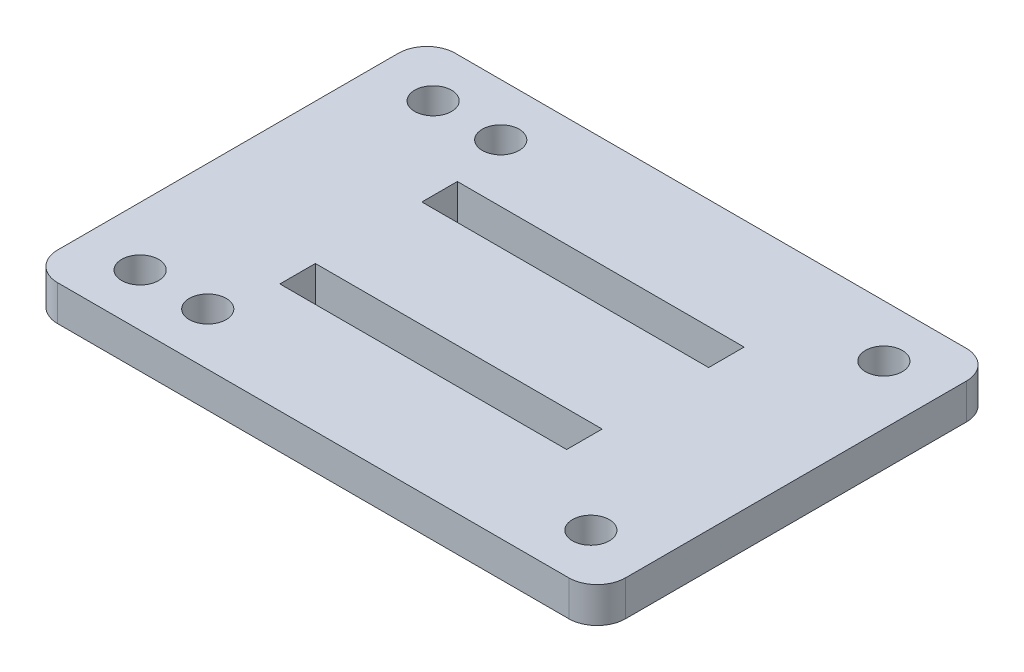
ISO-10303-21;
HEADER;
FILE_DESCRIPTION(('STEP AP214'),'2;1');
FILE_NAME('part.step','',(''),(''),'','','');
FILE_SCHEMA(('AUTOMOTIVE_DESIGN { 1 0 10303 214 1 1 1 1 }'));
ENDSEC;
DATA;
#1=APPLICATION_CONTEXT('core data for automotive mechanical design processes');
#2=APPLICATION_PROTOCOL_DEFINITION('international standard','automotive_design',2000,#1);
#3=PRODUCT_CONTEXT('',#1,'mechanical');
#4=PRODUCT('Part','Part','',(#3));
#5=PRODUCT_RELATED_PRODUCT_CATEGORY('part','',(#4));
#6=PRODUCT_DEFINITION_FORMATION('','',#4);
#7=PRODUCT_DEFINITION_CONTEXT('part definition',#1,'design');
#8=PRODUCT_DEFINITION('design','',#6,#7);
#9=PRODUCT_DEFINITION_SHAPE('','',#8);
#10=(LENGTH_UNIT() NAMED_UNIT(*) SI_UNIT(.MILLI.,.METRE.));
#11=(NAMED_UNIT(*) PLANE_ANGLE_UNIT() SI_UNIT($,.RADIAN.));
#12=(NAMED_UNIT(*) SI_UNIT($,.STERADIAN.) SOLID_ANGLE_UNIT());
#13=UNCERTAINTY_MEASURE_WITH_UNIT(LENGTH_MEASURE(1.E-05),#10,'distance_accuracy_value','');
#14=(GEOMETRIC_REPRESENTATION_CONTEXT(3) GLOBAL_UNCERTAINTY_ASSIGNED_CONTEXT((#13)) GLOBAL_UNIT_ASSIGNED_CONTEXT((#10,
#11,#12)) REPRESENTATION_CONTEXT('',''));
#15=CARTESIAN_POINT('',(0.,0.,0.));
#16=DIRECTION('',(0.,0.,1.));
#17=DIRECTION('',(1.,0.,0.));
#18=AXIS2_PLACEMENT_3D('',#15,#16,#17);
#19=CARTESIAN_POINT('',(40.,5.,28.));
#20=DIRECTION('',(-1.,0.,0.));
#21=DIRECTION('',(0.,0.,1.));
#22=AXIS2_PLACEMENT_3D('',#19,#20,#21);
#23=PLANE('',#22);
#24=DIRECTION('',(0.,0.,-1.));
#25=VECTOR('',#24,1.);
#26=CARTESIAN_POINT('',(40.,0.,28.));
#27=LINE('',#26,#25);
#28=CARTESIAN_POINT('',(40.,0.,24.));
#29=VERTEX_POINT('',#28);
#30=CARTESIAN_POINT('',(40.,0.,-24.));
#31=VERTEX_POINT('',#30);
#32=EDGE_CURVE('E258',#29,#31,#27,.T.);
#33=ORIENTED_EDGE('',*,*,#32,.T.);
#34=DIRECTION('',(0.,-1.,0.));
#35=VECTOR('',#34,1.);
#36=CARTESIAN_POINT('',(40.,5.,-24.));
#37=LINE('',#36,#35);
#38=CARTESIAN_POINT('',(40.,5.,-24.));
#39=VERTEX_POINT('',#38);
#40=EDGE_CURVE('E307',#31,#39,#37,.F.);
#41=ORIENTED_EDGE('',*,*,#40,.T.);
#42=DIRECTION('',(0.,0.,-1.));
#43=VECTOR('',#42,1.);
#44=CARTESIAN_POINT('',(40.,5.,28.));
#45=LINE('',#44,#43);
#46=CARTESIAN_POINT('',(40.,5.,24.));
#47=VERTEX_POINT('',#46);
#48=EDGE_CURVE('E259',#47,#39,#45,.T.);
#49=ORIENTED_EDGE('',*,*,#48,.F.);
#50=DIRECTION('',(0.,-1.,0.));
#51=VECTOR('',#50,1.);
#52=CARTESIAN_POINT('',(40.,5.,24.));
#53=LINE('',#52,#51);
#54=EDGE_CURVE('E304',#47,#29,#53,.T.);
#55=ORIENTED_EDGE('',*,*,#54,.T.);
#56=EDGE_LOOP('',(#33,#41,#49,#55));
#57=FACE_BOUND('',#56,.T.);
#58=ADVANCED_FACE('F45',(#57),#23,.F.);
#59=CARTESIAN_POINT('',(-40.,5.,-28.));
#60=DIRECTION('',(0.,0.,1.));
#61=DIRECTION('',(1.,0.,0.));
#62=AXIS2_PLACEMENT_3D('',#59,#60,#61);
#63=PLANE('',#62);
#64=DIRECTION('',(-1.,0.,0.));
#65=VECTOR('',#64,1.);
#66=CARTESIAN_POINT('',(-40.,0.,-28.));
#67=LINE('',#66,#65);
#68=CARTESIAN_POINT('',(36.,0.,-28.));
#69=VERTEX_POINT('',#68);
#70=CARTESIAN_POINT('',(-36.,0.,-28.));
#71=VERTEX_POINT('',#70);
#72=EDGE_CURVE('E273',#69,#71,#67,.T.);
#73=ORIENTED_EDGE('',*,*,#72,.T.);
#74=DIRECTION('',(0.,-1.,0.));
#75=VECTOR('',#74,1.);
#76=CARTESIAN_POINT('',(-36.,5.,-28.));
#77=LINE('',#76,#75);
#78=CARTESIAN_POINT('',(-36.,5.,-28.));
#79=VERTEX_POINT('',#78);
#80=EDGE_CURVE('E295',#71,#79,#77,.F.);
#81=ORIENTED_EDGE('',*,*,#80,.T.);
#82=DIRECTION('',(-1.,0.,0.));
#83=VECTOR('',#82,1.);
#84=CARTESIAN_POINT('',(-40.,5.,-28.));
#85=LINE('',#84,#83);
#86=CARTESIAN_POINT('',(36.,5.,-28.));
#87=VERTEX_POINT('',#86);
#88=EDGE_CURVE('E262',#87,#79,#85,.T.);
#89=ORIENTED_EDGE('',*,*,#88,.F.);
#90=DIRECTION('',(0.,-1.,0.));
#91=VECTOR('',#90,1.);
#92=CARTESIAN_POINT('',(36.,5.,-28.));
#93=LINE('',#92,#91);
#94=EDGE_CURVE('E292',#87,#69,#93,.T.);
#95=ORIENTED_EDGE('',*,*,#94,.T.);
#96=EDGE_LOOP('',(#73,#81,#89,#95));
#97=FACE_BOUND('',#96,.T.);
#98=ADVANCED_FACE('F331',(#97),#63,.F.);
#99=CARTESIAN_POINT('',(-40.,5.,28.));
#100=DIRECTION('',(1.,0.,0.));
#101=DIRECTION('',(0.,0.,-1.));
#102=AXIS2_PLACEMENT_3D('',#99,#100,#101);
#103=PLANE('',#102);
#104=DIRECTION('',(0.,0.,1.));
#105=VECTOR('',#104,1.);
#106=CARTESIAN_POINT('',(-40.,5.,28.));
#107=LINE('',#106,#105);
#108=CARTESIAN_POINT('',(-40.,5.,-24.));
#109=VERTEX_POINT('',#108);
#110=CARTESIAN_POINT('',(-40.,5.,24.));
#111=VERTEX_POINT('',#110);
#112=EDGE_CURVE('E266',#109,#111,#107,.T.);
#113=ORIENTED_EDGE('',*,*,#112,.F.);
#114=DIRECTION('',(0.,-1.,0.));
#115=VECTOR('',#114,1.);
#116=CARTESIAN_POINT('',(-40.,5.,-24.));
#117=LINE('',#116,#115);
#118=CARTESIAN_POINT('',(-40.,0.,-24.));
#119=VERTEX_POINT('',#118);
#120=EDGE_CURVE('E281',#109,#119,#117,.T.);
#121=ORIENTED_EDGE('',*,*,#120,.T.);
#122=DIRECTION('',(0.,0.,1.));
#123=VECTOR('',#122,1.);
#124=CARTESIAN_POINT('',(-40.,0.,28.));
#125=LINE('',#124,#123);
#126=CARTESIAN_POINT('',(-40.,0.,24.));
#127=VERTEX_POINT('',#126);
#128=EDGE_CURVE('E276',#119,#127,#125,.T.);
#129=ORIENTED_EDGE('',*,*,#128,.T.);
#130=DIRECTION('',(0.,-1.,0.));
#131=VECTOR('',#130,1.);
#132=CARTESIAN_POINT('',(-40.,5.,24.));
#133=LINE('',#132,#131);
#134=EDGE_CURVE('E270',#127,#111,#133,.F.);
#135=ORIENTED_EDGE('',*,*,#134,.T.);
#136=EDGE_LOOP('',(#113,#121,#129,#135));
#137=FACE_BOUND('',#136,.T.);
#138=ADVANCED_FACE('F339',(#137),#103,.F.);
#139=CARTESIAN_POINT('',(-40.,5.,28.));
#140=DIRECTION('',(0.,0.,-1.));
#141=DIRECTION('',(-1.,0.,0.));
#142=AXIS2_PLACEMENT_3D('',#139,#140,#141);
#143=PLANE('',#142);
#144=DIRECTION('',(1.,0.,0.));
#145=VECTOR('',#144,1.);
#146=CARTESIAN_POINT('',(-40.,0.,28.));
#147=LINE('',#146,#145);
#148=CARTESIAN_POINT('',(-36.,0.,28.));
#149=VERTEX_POINT('',#148);
#150=CARTESIAN_POINT('',(36.,0.,28.));
#151=VERTEX_POINT('',#150);
#152=EDGE_CURVE('E263',#149,#151,#147,.T.);
#153=ORIENTED_EDGE('',*,*,#152,.T.);
#154=DIRECTION('',(0.,-1.,0.));
#155=VECTOR('',#154,1.);
#156=CARTESIAN_POINT('',(36.,5.,28.));
#157=LINE('',#156,#155);
#158=CARTESIAN_POINT('',(36.,5.,28.));
#159=VERTEX_POINT('',#158);
#160=EDGE_CURVE('E11',#151,#159,#157,.F.);
#161=ORIENTED_EDGE('',*,*,#160,.T.);
#162=DIRECTION('',(1.,0.,0.));
#163=VECTOR('',#162,1.);
#164=CARTESIAN_POINT('',(-40.,5.,28.));
#165=LINE('',#164,#163);
#166=CARTESIAN_POINT('',(-36.,5.,28.));
#167=VERTEX_POINT('',#166);
#168=EDGE_CURVE('E268',#167,#159,#165,.T.);
#169=ORIENTED_EDGE('',*,*,#168,.F.);
#170=DIRECTION('',(0.,-1.,0.));
#171=VECTOR('',#170,1.);
#172=CARTESIAN_POINT('',(-36.,5.,28.));
#173=LINE('',#172,#171);
#174=EDGE_CURVE('E53',#167,#149,#173,.T.);
#175=ORIENTED_EDGE('',*,*,#174,.T.);
#176=EDGE_LOOP('',(#153,#161,#169,#175));
#177=FACE_BOUND('',#176,.T.);
#178=ADVANCED_FACE('F311',(#177),#143,.F.);
#179=CARTESIAN_POINT('',(0.,5.,0.));
#180=DIRECTION('',(0.,-1.,0.));
#181=DIRECTION('',(0.,0.,-1.));
#182=AXIS2_PLACEMENT_3D('',#179,#180,#181);
#183=PLANE('',#182);
#184=DIRECTION('',(-1.,0.,0.));
#185=VECTOR('',#184,1.);
#186=CARTESIAN_POINT('',(-20.2,5.,-7.5));
#187=LINE('',#186,#185);
#188=CARTESIAN_POINT('',(20.2,5.,-7.5));
#189=VERTEX_POINT('',#188);
#190=CARTESIAN_POINT('',(-20.2,5.,-7.5));
#191=VERTEX_POINT('',#190);
#192=EDGE_CURVE('E208',#189,#191,#187,.T.);
#193=ORIENTED_EDGE('',*,*,#192,.T.);
#194=DIRECTION('',(0.,0.,-1.));
#195=VECTOR('',#194,1.);
#196=CARTESIAN_POINT('',(-20.2,5.,-12.5));
#197=LINE('',#196,#195);
#198=CARTESIAN_POINT('',(-20.2,5.,-12.5));
#199=VERTEX_POINT('',#198);
#200=EDGE_CURVE('E212',#191,#199,#197,.T.);
#201=ORIENTED_EDGE('',*,*,#200,.T.);
#202=DIRECTION('',(1.,0.,0.));
#203=VECTOR('',#202,1.);
#204=CARTESIAN_POINT('',(-20.2,5.,-12.5));
#205=LINE('',#204,#203);
#206=CARTESIAN_POINT('',(20.2,5.,-12.5));
#207=VERTEX_POINT('',#206);
#208=EDGE_CURVE('E235',#199,#207,#205,.T.);
#209=ORIENTED_EDGE('',*,*,#208,.T.);
#210=DIRECTION('',(0.,0.,1.));
#211=VECTOR('',#210,1.);
#212=CARTESIAN_POINT('',(20.2,5.,-12.5));
#213=LINE('',#212,#211);
#214=EDGE_CURVE('E232',#207,#189,#213,.T.);
#215=ORIENTED_EDGE('',*,*,#214,.T.);
#216=EDGE_LOOP('',(#193,#201,#209,#215));
#217=FACE_BOUND('',#216,.T.);
#218=CARTESIAN_POINT('',(-31.75,5.,20.6375));
#219=DIRECTION('',(0.,-1.,0.));
#220=DIRECTION('',(0.,0.,-1.));
#221=AXIS2_PLACEMENT_3D('',#218,#219,#220);
#222=CIRCLE('',#221,2.6);
#223=CARTESIAN_POINT('',(-31.75,5.,18.0375));
#224=VERTEX_POINT('',#223);
#225=EDGE_CURVE('E200',#224,#224,#222,.T.);
#226=ORIENTED_EDGE('',*,*,#225,.T.);
#227=EDGE_LOOP('',(#226));
#228=FACE_BOUND('',#227,.T.);
#229=CARTESIAN_POINT('',(31.75,5.,20.6375));
#230=DIRECTION('',(0.,-1.,0.));
#231=DIRECTION('',(0.,0.,-1.));
#232=AXIS2_PLACEMENT_3D('',#229,#230,#231);
#233=CIRCLE('',#232,2.6);
#234=CARTESIAN_POINT('',(31.75,5.,18.0375));
#235=VERTEX_POINT('',#234);
#236=EDGE_CURVE('E207',#235,#235,#233,.T.);
#237=ORIENTED_EDGE('',*,*,#236,.T.);
#238=EDGE_LOOP('',(#237));
#239=FACE_BOUND('',#238,.T.);
#240=CARTESIAN_POINT('',(-31.75,5.,-20.6375));
#241=DIRECTION('',(0.,-1.,0.));
#242=DIRECTION('',(0.,0.,-1.));
#243=AXIS2_PLACEMENT_3D('',#240,#241,#242);
#244=CIRCLE('',#243,2.6);
#245=CARTESIAN_POINT('',(-31.75,5.,-23.2375));
#246=VERTEX_POINT('',#245);
#247=EDGE_CURVE('E241',#246,#246,#244,.T.);
#248=ORIENTED_EDGE('',*,*,#247,.T.);
#249=EDGE_LOOP('',(#248));
#250=FACE_BOUND('',#249,.T.);
#251=DIRECTION('',(1.,0.,0.));
#252=VECTOR('',#251,1.);
#253=CARTESIAN_POINT('',(-20.2,5.,7.5));
#254=LINE('',#253,#252);
#255=CARTESIAN_POINT('',(-20.2,5.,7.5));
#256=VERTEX_POINT('',#255);
#257=CARTESIAN_POINT('',(20.2,5.,7.5));
#258=VERTEX_POINT('',#257);
#259=EDGE_CURVE('E183',#256,#258,#254,.T.);
#260=ORIENTED_EDGE('',*,*,#259,.T.);
#261=DIRECTION('',(0.,0.,1.));
#262=VECTOR('',#261,1.);
#263=CARTESIAN_POINT('',(20.2,5.,12.5));
#264=LINE('',#263,#262);
#265=CARTESIAN_POINT('',(20.2,5.,12.5));
#266=VERTEX_POINT('',#265);
#267=EDGE_CURVE('E168',#258,#266,#264,.T.);
#268=ORIENTED_EDGE('',*,*,#267,.T.);
#269=DIRECTION('',(-1.,0.,0.));
#270=VECTOR('',#269,1.);
#271=CARTESIAN_POINT('',(-20.2,5.,12.5));
#272=LINE('',#271,#270);
#273=CARTESIAN_POINT('',(-20.2,5.,12.5));
#274=VERTEX_POINT('',#273);
#275=EDGE_CURVE('E158',#266,#274,#272,.T.);
#276=ORIENTED_EDGE('',*,*,#275,.T.);
#277=DIRECTION('',(0.,0.,-1.));
#278=VECTOR('',#277,1.);
#279=CARTESIAN_POINT('',(-20.2,5.,12.5));
#280=LINE('',#279,#278);
#281=EDGE_CURVE('E169',#274,#256,#280,.T.);
#282=ORIENTED_EDGE('',*,*,#281,.T.);
#283=EDGE_LOOP('',(#260,#268,#276,#282));
#284=FACE_BOUND('',#283,.T.);
#285=CARTESIAN_POINT('',(-22.225,5.,-20.6375));
#286=DIRECTION('',(0.,-1.,0.));
#287=DIRECTION('',(0.,0.,-1.));
#288=AXIS2_PLACEMENT_3D('',#285,#286,#287);
#289=CIRCLE('',#288,2.6);
#290=CARTESIAN_POINT('',(-22.225,5.,-23.2375));
#291=VERTEX_POINT('',#290);
#292=EDGE_CURVE('E188',#291,#291,#289,.T.);
#293=ORIENTED_EDGE('',*,*,#292,.T.);
#294=EDGE_LOOP('',(#293));
#295=FACE_BOUND('',#294,.T.);
#296=CARTESIAN_POINT('',(-22.225,5.,20.6375));
#297=DIRECTION('',(0.,-1.,0.));
#298=DIRECTION('',(0.,0.,-1.));
#299=AXIS2_PLACEMENT_3D('',#296,#297,#298);
#300=CIRCLE('',#299,2.6);
#301=CARTESIAN_POINT('',(-22.225,5.,18.0375));
#302=VERTEX_POINT('',#301);
#303=EDGE_CURVE('E195',#302,#302,#300,.T.);
#304=ORIENTED_EDGE('',*,*,#303,.T.);
#305=EDGE_LOOP('',(#304));
#306=FACE_BOUND('',#305,.T.);
#307=CARTESIAN_POINT('',(31.75,5.,-20.6375));
#308=DIRECTION('',(0.,-1.,0.));
#309=DIRECTION('',(0.,0.,-1.));
#310=AXIS2_PLACEMENT_3D('',#307,#308,#309);
#311=CIRCLE('',#310,2.6);
#312=CARTESIAN_POINT('',(31.75,5.,-23.2375));
#313=VERTEX_POINT('',#312);
#314=EDGE_CURVE('E255',#313,#313,#311,.T.);
#315=ORIENTED_EDGE('',*,*,#314,.T.);
#316=EDGE_LOOP('',(#315));
#317=FACE_BOUND('',#316,.T.);
#318=ORIENTED_EDGE('',*,*,#88,.T.);
#319=CARTESIAN_POINT('',(-36.,5.,-24.));
#320=DIRECTION('',(0.,-1.,0.));
#321=DIRECTION('',(0.,0.,-1.));
#322=AXIS2_PLACEMENT_3D('',#319,#320,#321);
#323=CIRCLE('',#322,4.);
#324=EDGE_CURVE('E302',#79,#109,#323,.F.);
#325=ORIENTED_EDGE('',*,*,#324,.T.);
#326=ORIENTED_EDGE('',*,*,#112,.T.);
#327=CARTESIAN_POINT('',(-36.,5.,24.));
#328=DIRECTION('',(0.,-1.,0.));
#329=DIRECTION('',(0.,0.,-1.));
#330=AXIS2_PLACEMENT_3D('',#327,#328,#329);
#331=CIRCLE('',#330,4.);
#332=EDGE_CURVE('E65',#111,#167,#331,.F.);
#333=ORIENTED_EDGE('',*,*,#332,.T.);
#334=ORIENTED_EDGE('',*,*,#168,.T.);
#335=CARTESIAN_POINT('',(36.,5.,24.));
#336=DIRECTION('',(0.,-1.,0.));
#337=DIRECTION('',(0.,0.,-1.));
#338=AXIS2_PLACEMENT_3D('',#335,#336,#337);
#339=CIRCLE('',#338,4.);
#340=EDGE_CURVE('E298',#159,#47,#339,.F.);
#341=ORIENTED_EDGE('',*,*,#340,.T.);
#342=ORIENTED_EDGE('',*,*,#48,.T.);
#343=CARTESIAN_POINT('',(36.,5.,-24.));
#344=DIRECTION('',(0.,-1.,0.));
#345=DIRECTION('',(0.,0.,-1.));
#346=AXIS2_PLACEMENT_3D('',#343,#344,#345);
#347=CIRCLE('',#346,4.);
#348=EDGE_CURVE('E300',#39,#87,#347,.F.);
#349=ORIENTED_EDGE('',*,*,#348,.T.);
#350=EDGE_LOOP('',(#318,#325,#326,#333,#334,#341,#342,#349));
#351=FACE_BOUND('',#350,.T.);
#352=ADVANCED_FACE('F180',(#217,#228,#239,#250,#284,#295,#306,#317,#351),#183,.F.);
#353=CARTESIAN_POINT('',(0.,0.,0.));
#354=DIRECTION('',(0.,-1.,0.));
#355=DIRECTION('',(0.,0.,-1.));
#356=AXIS2_PLACEMENT_3D('',#353,#354,#355);
#357=PLANE('',#356);
#358=DIRECTION('',(0.,0.,1.));
#359=VECTOR('',#358,1.);
#360=CARTESIAN_POINT('',(-20.2,0.,-12.5));
#361=LINE('',#360,#359);
#362=CARTESIAN_POINT('',(-20.2,0.,-12.5));
#363=VERTEX_POINT('',#362);
#364=CARTESIAN_POINT('',(-20.2,0.,-7.5));
#365=VERTEX_POINT('',#364);
#366=EDGE_CURVE('E224',#363,#365,#361,.T.);
#367=ORIENTED_EDGE('',*,*,#366,.T.);
#368=DIRECTION('',(1.,0.,0.));
#369=VECTOR('',#368,1.);
#370=CARTESIAN_POINT('',(-20.2,0.,-7.5));
#371=LINE('',#370,#369);
#372=CARTESIAN_POINT('',(20.2,0.,-7.5));
#373=VERTEX_POINT('',#372);
#374=EDGE_CURVE('E221',#365,#373,#371,.T.);
#375=ORIENTED_EDGE('',*,*,#374,.T.);
#376=DIRECTION('',(0.,0.,-1.));
#377=VECTOR('',#376,1.);
#378=CARTESIAN_POINT('',(20.2,0.,-12.5));
#379=LINE('',#378,#377);
#380=CARTESIAN_POINT('',(20.2,0.,-12.5));
#381=VERTEX_POINT('',#380);
#382=EDGE_CURVE('E204',#373,#381,#379,.T.);
#383=ORIENTED_EDGE('',*,*,#382,.T.);
#384=DIRECTION('',(-1.,0.,0.));
#385=VECTOR('',#384,1.);
#386=CARTESIAN_POINT('',(-20.2,0.,-12.5));
#387=LINE('',#386,#385);
#388=EDGE_CURVE('E227',#381,#363,#387,.T.);
#389=ORIENTED_EDGE('',*,*,#388,.T.);
#390=EDGE_LOOP('',(#367,#375,#383,#389));
#391=FACE_BOUND('',#390,.T.);
#392=CARTESIAN_POINT('',(-31.75,0.,20.6375));
#393=DIRECTION('',(0.,1.,0.));
#394=DIRECTION('',(0.,0.,-1.));
#395=AXIS2_PLACEMENT_3D('',#392,#393,#394);
#396=CIRCLE('',#395,2.6);
#397=CARTESIAN_POINT('',(-31.75,0.,18.0375));
#398=VERTEX_POINT('',#397);
#399=EDGE_CURVE('E203',#398,#398,#396,.T.);
#400=ORIENTED_EDGE('',*,*,#399,.T.);
#401=EDGE_LOOP('',(#400));
#402=FACE_BOUND('',#401,.T.);
#403=CARTESIAN_POINT('',(31.75,0.,20.6375));
#404=DIRECTION('',(0.,1.,0.));
#405=DIRECTION('',(0.,0.,1.));
#406=AXIS2_PLACEMENT_3D('',#403,#404,#405);
#407=CIRCLE('',#406,2.6);
#408=CARTESIAN_POINT('',(31.75,0.,23.2375));
#409=VERTEX_POINT('',#408);
#410=EDGE_CURVE('E245',#409,#409,#407,.T.);
#411=ORIENTED_EDGE('',*,*,#410,.T.);
#412=EDGE_LOOP('',(#411));
#413=FACE_BOUND('',#412,.T.);
#414=CARTESIAN_POINT('',(-31.75,0.,-20.6375));
#415=DIRECTION('',(0.,1.,0.));
#416=DIRECTION('',(0.,0.,1.));
#417=AXIS2_PLACEMENT_3D('',#414,#415,#416);
#418=CIRCLE('',#417,2.6);
#419=CARTESIAN_POINT('',(-31.75,0.,-18.0375));
#420=VERTEX_POINT('',#419);
#421=EDGE_CURVE('E244',#420,#420,#418,.T.);
#422=ORIENTED_EDGE('',*,*,#421,.T.);
#423=EDGE_LOOP('',(#422));
#424=FACE_BOUND('',#423,.T.);
#425=DIRECTION('',(0.,0.,-1.));
#426=VECTOR('',#425,1.);
#427=CARTESIAN_POINT('',(20.2,0.,12.5));
#428=LINE('',#427,#426);
#429=CARTESIAN_POINT('',(20.2,0.,12.5));
#430=VERTEX_POINT('',#429);
#431=CARTESIAN_POINT('',(20.2,0.,7.5));
#432=VERTEX_POINT('',#431);
#433=EDGE_CURVE('E175',#430,#432,#428,.T.);
#434=ORIENTED_EDGE('',*,*,#433,.T.);
#435=DIRECTION('',(-1.,0.,0.));
#436=VECTOR('',#435,1.);
#437=CARTESIAN_POINT('',(-20.2,0.,7.5));
#438=LINE('',#437,#436);
#439=CARTESIAN_POINT('',(-20.2,0.,7.5));
#440=VERTEX_POINT('',#439);
#441=EDGE_CURVE('E566',#432,#440,#438,.T.);
#442=ORIENTED_EDGE('',*,*,#441,.T.);
#443=DIRECTION('',(0.,0.,1.));
#444=VECTOR('',#443,1.);
#445=CARTESIAN_POINT('',(-20.2,0.,12.5));
#446=LINE('',#445,#444);
#447=CARTESIAN_POINT('',(-20.2,0.,12.5));
#448=VERTEX_POINT('',#447);
#449=EDGE_CURVE('E236',#440,#448,#446,.T.);
#450=ORIENTED_EDGE('',*,*,#449,.T.);
#451=DIRECTION('',(1.,0.,0.));
#452=VECTOR('',#451,1.);
#453=CARTESIAN_POINT('',(-20.2,0.,12.5));
#454=LINE('',#453,#452);
#455=EDGE_CURVE('E567',#448,#430,#454,.T.);
#456=ORIENTED_EDGE('',*,*,#455,.T.);
#457=EDGE_LOOP('',(#434,#442,#450,#456));
#458=FACE_BOUND('',#457,.T.);
#459=CARTESIAN_POINT('',(-22.225,0.,-20.6375));
#460=DIRECTION('',(0.,1.,0.));
#461=DIRECTION('',(0.,0.,1.));
#462=AXIS2_PLACEMENT_3D('',#459,#460,#461);
#463=CIRCLE('',#462,2.6);
#464=CARTESIAN_POINT('',(-22.225,0.,-18.0375));
#465=VERTEX_POINT('',#464);
#466=EDGE_CURVE('E191',#465,#465,#463,.T.);
#467=ORIENTED_EDGE('',*,*,#466,.T.);
#468=EDGE_LOOP('',(#467));
#469=FACE_BOUND('',#468,.T.);
#470=CARTESIAN_POINT('',(-22.225,0.,20.6375));
#471=DIRECTION('',(0.,1.,0.));
#472=DIRECTION('',(0.,0.,-1.));
#473=AXIS2_PLACEMENT_3D('',#470,#471,#472);
#474=CIRCLE('',#473,2.6);
#475=CARTESIAN_POINT('',(-22.225,0.,18.0375));
#476=VERTEX_POINT('',#475);
#477=EDGE_CURVE('E192',#476,#476,#474,.T.);
#478=ORIENTED_EDGE('',*,*,#477,.T.);
#479=EDGE_LOOP('',(#478));
#480=FACE_BOUND('',#479,.T.);
#481=CARTESIAN_POINT('',(31.75,0.,-20.6375));
#482=DIRECTION('',(0.,1.,0.));
#483=DIRECTION('',(0.,0.,-1.));
#484=AXIS2_PLACEMENT_3D('',#481,#482,#483);
#485=CIRCLE('',#484,2.6);
#486=CARTESIAN_POINT('',(31.75,0.,-23.2375));
#487=VERTEX_POINT('',#486);
#488=EDGE_CURVE('E248',#487,#487,#485,.T.);
#489=ORIENTED_EDGE('',*,*,#488,.T.);
#490=EDGE_LOOP('',(#489));
#491=FACE_BOUND('',#490,.T.);
#492=ORIENTED_EDGE('',*,*,#128,.F.);
#493=CARTESIAN_POINT('',(-36.,0.,-24.));
#494=DIRECTION('',(0.,-1.,0.));
#495=DIRECTION('',(0.,0.,-1.));
#496=AXIS2_PLACEMENT_3D('',#493,#494,#495);
#497=CIRCLE('',#496,4.);
#498=EDGE_CURVE('E290',#119,#71,#497,.T.);
#499=ORIENTED_EDGE('',*,*,#498,.T.);
#500=ORIENTED_EDGE('',*,*,#72,.F.);
#501=CARTESIAN_POINT('',(36.,0.,-24.));
#502=DIRECTION('',(0.,-1.,0.));
#503=DIRECTION('',(0.,0.,-1.));
#504=AXIS2_PLACEMENT_3D('',#501,#502,#503);
#505=CIRCLE('',#504,4.);
#506=EDGE_CURVE('E288',#69,#31,#505,.T.);
#507=ORIENTED_EDGE('',*,*,#506,.T.);
#508=ORIENTED_EDGE('',*,*,#32,.F.);
#509=CARTESIAN_POINT('',(36.,0.,24.));
#510=DIRECTION('',(0.,-1.,0.));
#511=DIRECTION('',(0.,0.,-1.));
#512=AXIS2_PLACEMENT_3D('',#509,#510,#511);
#513=CIRCLE('',#512,4.);
#514=EDGE_CURVE('E286',#29,#151,#513,.T.);
#515=ORIENTED_EDGE('',*,*,#514,.T.);
#516=ORIENTED_EDGE('',*,*,#152,.F.);
#517=CARTESIAN_POINT('',(-36.,0.,24.));
#518=DIRECTION('',(0.,-1.,0.));
#519=DIRECTION('',(0.,0.,-1.));
#520=AXIS2_PLACEMENT_3D('',#517,#518,#519);
#521=CIRCLE('',#520,4.);
#522=EDGE_CURVE('E284',#149,#127,#521,.T.);
#523=ORIENTED_EDGE('',*,*,#522,.T.);
#524=EDGE_LOOP('',(#492,#499,#500,#507,#508,#515,#516,#523));
#525=FACE_BOUND('',#524,.T.);
#526=ADVANCED_FACE('F315',(#391,#402,#413,#424,#458,#469,#480,#491,#525),#357,.T.);
#527=CARTESIAN_POINT('',(31.75,45.708230126106,-20.6375));
#528=DIRECTION('',(0.,-1.,0.));
#529=DIRECTION('',(0.,0.,-1.));
#530=AXIS2_PLACEMENT_3D('',#527,#528,#529);
#531=CYLINDRICAL_SURFACE('',#530,2.6);
#532=ORIENTED_EDGE('',*,*,#314,.F.);
#533=EDGE_LOOP('',(#532));
#534=FACE_BOUND('',#533,.T.);
#535=ORIENTED_EDGE('',*,*,#488,.F.);
#536=EDGE_LOOP('',(#535));
#537=FACE_BOUND('',#536,.T.);
#538=ADVANCED_FACE('F489',(#534,#537),#531,.F.);
#539=CARTESIAN_POINT('',(-22.225,45.708230126106,20.6375));
#540=DIRECTION('',(0.,-1.,0.));
#541=DIRECTION('',(0.,0.,-1.));
#542=AXIS2_PLACEMENT_3D('',#539,#540,#541);
#543=CYLINDRICAL_SURFACE('',#542,2.6);
#544=ORIENTED_EDGE('',*,*,#303,.F.);
#545=EDGE_LOOP('',(#544));
#546=FACE_BOUND('',#545,.T.);
#547=ORIENTED_EDGE('',*,*,#477,.F.);
#548=EDGE_LOOP('',(#547));
#549=FACE_BOUND('',#548,.T.);
#550=ADVANCED_FACE('F480',(#546,#549),#543,.F.);
#551=CARTESIAN_POINT('',(-22.225,45.708230126106,-20.6375));
#552=DIRECTION('',(0.,-1.,0.));
#553=DIRECTION('',(0.,0.,-1.));
#554=AXIS2_PLACEMENT_3D('',#551,#552,#553);
#555=CYLINDRICAL_SURFACE('',#554,2.6);
#556=ORIENTED_EDGE('',*,*,#292,.F.);
#557=EDGE_LOOP('',(#556));
#558=FACE_BOUND('',#557,.T.);
#559=ORIENTED_EDGE('',*,*,#466,.F.);
#560=EDGE_LOOP('',(#559));
#561=FACE_BOUND('',#560,.T.);
#562=ADVANCED_FACE('F471',(#558,#561),#555,.F.);
#563=CARTESIAN_POINT('',(-20.2,45.708230126106,7.5));
#564=DIRECTION('',(0.,0.,1.));
#565=DIRECTION('',(1.,0.,0.));
#566=AXIS2_PLACEMENT_3D('',#563,#564,#565);
#567=PLANE('',#566);
#568=DIRECTION('',(0.,-1.,0.));
#569=VECTOR('',#568,1.);
#570=CARTESIAN_POINT('',(-20.2,45.708230126106,7.5));
#571=LINE('',#570,#569);
#572=EDGE_CURVE('E570',#256,#440,#571,.T.);
#573=ORIENTED_EDGE('',*,*,#572,.T.);
#574=ORIENTED_EDGE('',*,*,#441,.F.);
#575=DIRECTION('',(0.,-1.,0.));
#576=VECTOR('',#575,1.);
#577=CARTESIAN_POINT('',(20.2,45.708230126106,7.5));
#578=LINE('',#577,#576);
#579=EDGE_CURVE('E177',#258,#432,#578,.T.);
#580=ORIENTED_EDGE('',*,*,#579,.F.);
#581=ORIENTED_EDGE('',*,*,#259,.F.);
#582=EDGE_LOOP('',(#573,#574,#580,#581));
#583=FACE_BOUND('',#582,.T.);
#584=ADVANCED_FACE('F463',(#583),#567,.T.);
#585=CARTESIAN_POINT('',(20.2,45.708230126106,12.5));
#586=DIRECTION('',(-1.,0.,0.));
#587=DIRECTION('',(0.,0.,1.));
#588=AXIS2_PLACEMENT_3D('',#585,#586,#587);
#589=PLANE('',#588);
#590=ORIENTED_EDGE('',*,*,#579,.T.);
#591=ORIENTED_EDGE('',*,*,#433,.F.);
#592=DIRECTION('',(0.,-1.,0.));
#593=VECTOR('',#592,1.);
#594=CARTESIAN_POINT('',(20.2,45.708230126106,12.5));
#595=LINE('',#594,#593);
#596=EDGE_CURVE('E161',#266,#430,#595,.T.);
#597=ORIENTED_EDGE('',*,*,#596,.F.);
#598=ORIENTED_EDGE('',*,*,#267,.F.);
#599=EDGE_LOOP('',(#590,#591,#597,#598));
#600=FACE_BOUND('',#599,.T.);
#601=ADVANCED_FACE('F172',(#600),#589,.T.);
#602=CARTESIAN_POINT('',(-20.2,45.708230126106,12.5));
#603=DIRECTION('',(0.,0.,-1.));
#604=DIRECTION('',(-1.,0.,0.));
#605=AXIS2_PLACEMENT_3D('',#602,#603,#604);
#606=PLANE('',#605);
#607=ORIENTED_EDGE('',*,*,#596,.T.);
#608=ORIENTED_EDGE('',*,*,#455,.F.);
#609=DIRECTION('',(0.,-1.,0.));
#610=VECTOR('',#609,1.);
#611=CARTESIAN_POINT('',(-20.2,45.708230126106,12.5));
#612=LINE('',#611,#610);
#613=EDGE_CURVE('E164',#274,#448,#612,.T.);
#614=ORIENTED_EDGE('',*,*,#613,.F.);
#615=ORIENTED_EDGE('',*,*,#275,.F.);
#616=EDGE_LOOP('',(#607,#608,#614,#615));
#617=FACE_BOUND('',#616,.T.);
#618=ADVANCED_FACE('F160',(#617),#606,.T.);
#619=CARTESIAN_POINT('',(-20.2,45.708230126106,12.5));
#620=DIRECTION('',(1.,0.,0.));
#621=DIRECTION('',(0.,0.,-1.));
#622=AXIS2_PLACEMENT_3D('',#619,#620,#621);
#623=PLANE('',#622);
#624=ORIENTED_EDGE('',*,*,#613,.T.);
#625=ORIENTED_EDGE('',*,*,#449,.F.);
#626=ORIENTED_EDGE('',*,*,#572,.F.);
#627=ORIENTED_EDGE('',*,*,#281,.F.);
#628=EDGE_LOOP('',(#624,#625,#626,#627));
#629=FACE_BOUND('',#628,.T.);
#630=ADVANCED_FACE('F439',(#629),#623,.T.);
#631=CARTESIAN_POINT('',(-31.75,45.708230126106,-20.6375));
#632=DIRECTION('',(0.,-1.,0.));
#633=DIRECTION('',(0.,0.,-1.));
#634=AXIS2_PLACEMENT_3D('',#631,#632,#633);
#635=CYLINDRICAL_SURFACE('',#634,2.6);
#636=ORIENTED_EDGE('',*,*,#247,.F.);
#637=EDGE_LOOP('',(#636));
#638=FACE_BOUND('',#637,.T.);
#639=ORIENTED_EDGE('',*,*,#421,.F.);
#640=EDGE_LOOP('',(#639));
#641=FACE_BOUND('',#640,.T.);
#642=ADVANCED_FACE('F430',(#638,#641),#635,.F.);
#643=CARTESIAN_POINT('',(31.75,45.708230126106,20.6375));
#644=DIRECTION('',(0.,-1.,0.));
#645=DIRECTION('',(0.,0.,-1.));
#646=AXIS2_PLACEMENT_3D('',#643,#644,#645);
#647=CYLINDRICAL_SURFACE('',#646,2.6);
#648=ORIENTED_EDGE('',*,*,#236,.F.);
#649=EDGE_LOOP('',(#648));
#650=FACE_BOUND('',#649,.T.);
#651=ORIENTED_EDGE('',*,*,#410,.F.);
#652=EDGE_LOOP('',(#651));
#653=FACE_BOUND('',#652,.T.);
#654=ADVANCED_FACE('F421',(#650,#653),#647,.F.);
#655=CARTESIAN_POINT('',(-31.75,45.708230126106,20.6375));
#656=DIRECTION('',(0.,-1.,0.));
#657=DIRECTION('',(0.,0.,-1.));
#658=AXIS2_PLACEMENT_3D('',#655,#656,#657);
#659=CYLINDRICAL_SURFACE('',#658,2.6);
#660=ORIENTED_EDGE('',*,*,#225,.F.);
#661=EDGE_LOOP('',(#660));
#662=FACE_BOUND('',#661,.T.);
#663=ORIENTED_EDGE('',*,*,#399,.F.);
#664=EDGE_LOOP('',(#663));
#665=FACE_BOUND('',#664,.T.);
#666=ADVANCED_FACE('F412',(#662,#665),#659,.F.);
#667=CARTESIAN_POINT('',(-20.2,45.708230126106,-7.5));
#668=DIRECTION('',(0.,0.,-1.));
#669=DIRECTION('',(-1.,0.,0.));
#670=AXIS2_PLACEMENT_3D('',#667,#668,#669);
#671=PLANE('',#670);
#672=DIRECTION('',(0.,-1.,0.));
#673=VECTOR('',#672,1.);
#674=CARTESIAN_POINT('',(20.2,45.708230126106,-7.5));
#675=LINE('',#674,#673);
#676=EDGE_CURVE('E219',#189,#373,#675,.T.);
#677=ORIENTED_EDGE('',*,*,#676,.T.);
#678=ORIENTED_EDGE('',*,*,#374,.F.);
#679=DIRECTION('',(0.,-1.,0.));
#680=VECTOR('',#679,1.);
#681=CARTESIAN_POINT('',(-20.2,45.708230126106,-7.5));
#682=LINE('',#681,#680);
#683=EDGE_CURVE('E217',#191,#365,#682,.T.);
#684=ORIENTED_EDGE('',*,*,#683,.F.);
#685=ORIENTED_EDGE('',*,*,#192,.F.);
#686=EDGE_LOOP('',(#677,#678,#684,#685));
#687=FACE_BOUND('',#686,.T.);
#688=ADVANCED_FACE('F403',(#687),#671,.T.);
#689=CARTESIAN_POINT('',(-20.2,45.708230126106,-12.5));
#690=DIRECTION('',(1.,0.,0.));
#691=DIRECTION('',(0.,0.,-1.));
#692=AXIS2_PLACEMENT_3D('',#689,#690,#691);
#693=PLANE('',#692);
#694=ORIENTED_EDGE('',*,*,#683,.T.);
#695=ORIENTED_EDGE('',*,*,#366,.F.);
#696=DIRECTION('',(0.,-1.,0.));
#697=VECTOR('',#696,1.);
#698=CARTESIAN_POINT('',(-20.2,45.708230126106,-12.5));
#699=LINE('',#698,#697);
#700=EDGE_CURVE('E215',#199,#363,#699,.T.);
#701=ORIENTED_EDGE('',*,*,#700,.F.);
#702=ORIENTED_EDGE('',*,*,#200,.F.);
#703=EDGE_LOOP('',(#694,#695,#701,#702));
#704=FACE_BOUND('',#703,.T.);
#705=ADVANCED_FACE('F394',(#704),#693,.T.);
#706=CARTESIAN_POINT('',(-20.2,45.708230126106,-12.5));
#707=DIRECTION('',(0.,0.,1.));
#708=DIRECTION('',(1.,0.,0.));
#709=AXIS2_PLACEMENT_3D('',#706,#707,#708);
#710=PLANE('',#709);
#711=ORIENTED_EDGE('',*,*,#700,.T.);
#712=ORIENTED_EDGE('',*,*,#388,.F.);
#713=DIRECTION('',(0.,-1.,0.));
#714=VECTOR('',#713,1.);
#715=CARTESIAN_POINT('',(20.2,45.708230126106,-12.5));
#716=LINE('',#715,#714);
#717=EDGE_CURVE('E211',#207,#381,#716,.T.);
#718=ORIENTED_EDGE('',*,*,#717,.F.);
#719=ORIENTED_EDGE('',*,*,#208,.F.);
#720=EDGE_LOOP('',(#711,#712,#718,#719));
#721=FACE_BOUND('',#720,.T.);
#722=ADVANCED_FACE('F385',(#721),#710,.T.);
#723=CARTESIAN_POINT('',(20.2,45.708230126106,-12.5));
#724=DIRECTION('',(-1.,0.,0.));
#725=DIRECTION('',(0.,0.,1.));
#726=AXIS2_PLACEMENT_3D('',#723,#724,#725);
#727=PLANE('',#726);
#728=ORIENTED_EDGE('',*,*,#717,.T.);
#729=ORIENTED_EDGE('',*,*,#382,.F.);
#730=ORIENTED_EDGE('',*,*,#676,.F.);
#731=ORIENTED_EDGE('',*,*,#214,.F.);
#732=EDGE_LOOP('',(#728,#729,#730,#731));
#733=FACE_BOUND('',#732,.T.);
#734=ADVANCED_FACE('F356',(#733),#727,.T.);
#735=CARTESIAN_POINT('',(-36.,5.,-24.));
#736=DIRECTION('',(0.,-1.,0.));
#737=DIRECTION('',(0.,0.,-1.));
#738=AXIS2_PLACEMENT_3D('',#735,#736,#737);
#739=CYLINDRICAL_SURFACE('',#738,4.);
#740=ORIENTED_EDGE('',*,*,#324,.F.);
#741=ORIENTED_EDGE('',*,*,#80,.F.);
#742=ORIENTED_EDGE('',*,*,#498,.F.);
#743=ORIENTED_EDGE('',*,*,#120,.F.);
#744=EDGE_LOOP('',(#740,#741,#742,#743));
#745=FACE_BOUND('',#744,.T.);
#746=ADVANCED_FACE('F336',(#745),#739,.T.);
#747=CARTESIAN_POINT('',(36.,5.,-24.));
#748=DIRECTION('',(0.,-1.,0.));
#749=DIRECTION('',(0.,0.,-1.));
#750=AXIS2_PLACEMENT_3D('',#747,#748,#749);
#751=CYLINDRICAL_SURFACE('',#750,4.);
#752=ORIENTED_EDGE('',*,*,#348,.F.);
#753=ORIENTED_EDGE('',*,*,#40,.F.);
#754=ORIENTED_EDGE('',*,*,#506,.F.);
#755=ORIENTED_EDGE('',*,*,#94,.F.);
#756=EDGE_LOOP('',(#752,#753,#754,#755));
#757=FACE_BOUND('',#756,.T.);
#758=ADVANCED_FACE('F328',(#757),#751,.T.);
#759=CARTESIAN_POINT('',(36.,5.,24.));
#760=DIRECTION('',(0.,-1.,0.));
#761=DIRECTION('',(0.,0.,-1.));
#762=AXIS2_PLACEMENT_3D('',#759,#760,#761);
#763=CYLINDRICAL_SURFACE('',#762,4.);
#764=ORIENTED_EDGE('',*,*,#340,.F.);
#765=ORIENTED_EDGE('',*,*,#160,.F.);
#766=ORIENTED_EDGE('',*,*,#514,.F.);
#767=ORIENTED_EDGE('',*,*,#54,.F.);
#768=EDGE_LOOP('',(#764,#765,#766,#767));
#769=FACE_BOUND('',#768,.T.);
#770=ADVANCED_FACE('F320',(#769),#763,.T.);
#771=CARTESIAN_POINT('',(-36.,5.,24.));
#772=DIRECTION('',(0.,-1.,0.));
#773=DIRECTION('',(0.,0.,-1.));
#774=AXIS2_PLACEMENT_3D('',#771,#772,#773);
#775=CYLINDRICAL_SURFACE('',#774,4.);
#776=ORIENTED_EDGE('',*,*,#332,.F.);
#777=ORIENTED_EDGE('',*,*,#134,.F.);
#778=ORIENTED_EDGE('',*,*,#522,.F.);
#779=ORIENTED_EDGE('',*,*,#174,.F.);
#780=EDGE_LOOP('',(#776,#777,#778,#779));
#781=FACE_BOUND('',#780,.T.);
#782=ADVANCED_FACE('F47',(#781),#775,.T.);
#783=CLOSED_SHELL('',(#58,#98,#138,#178,#352,#526,#538,#550,#562,#584,#601,#618,#630,#642,#654,
#666,#688,#705,#722,#734,#746,#758,#770,#782));
#784=MANIFOLD_SOLID_BREP('B2',#783);
#785=ADVANCED_BREP_SHAPE_REPRESENTATION('',(#18,#784),#14);
#786=SHAPE_DEFINITION_REPRESENTATION(#9,#785);
ENDSEC;
END-ISO-10303-21;
